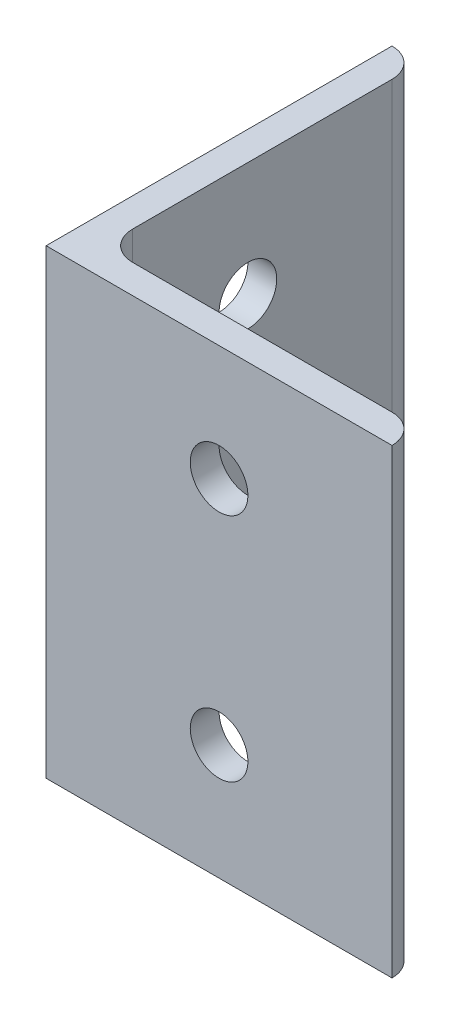
ISO-10303-21;
HEADER;
FILE_DESCRIPTION(('STEP AP214'),'2;1');
FILE_NAME('part.step','',(''),(''),'','','');
FILE_SCHEMA(('AUTOMOTIVE_DESIGN { 1 0 10303 214 1 1 1 1 }'));
ENDSEC;
DATA;
#1=APPLICATION_CONTEXT('core data for automotive mechanical design processes');
#2=APPLICATION_PROTOCOL_DEFINITION('international standard','automotive_design',2000,#1);
#3=PRODUCT_CONTEXT('',#1,'mechanical');
#4=PRODUCT('Part','Part','',(#3));
#5=PRODUCT_RELATED_PRODUCT_CATEGORY('part','',(#4));
#6=PRODUCT_DEFINITION_FORMATION('','',#4);
#7=PRODUCT_DEFINITION_CONTEXT('part definition',#1,'design');
#8=PRODUCT_DEFINITION('design','',#6,#7);
#9=PRODUCT_DEFINITION_SHAPE('','',#8);
#10=(LENGTH_UNIT() NAMED_UNIT(*) SI_UNIT(.MILLI.,.METRE.));
#11=(NAMED_UNIT(*) PLANE_ANGLE_UNIT() SI_UNIT($,.RADIAN.));
#12=(NAMED_UNIT(*) SI_UNIT($,.STERADIAN.) SOLID_ANGLE_UNIT());
#13=UNCERTAINTY_MEASURE_WITH_UNIT(LENGTH_MEASURE(1.E-05),#10,'distance_accuracy_value','');
#14=(GEOMETRIC_REPRESENTATION_CONTEXT(3) GLOBAL_UNCERTAINTY_ASSIGNED_CONTEXT((#13)) GLOBAL_UNIT_ASSIGNED_CONTEXT((#10,
#11,#12)) REPRESENTATION_CONTEXT('',''));
#15=CARTESIAN_POINT('',(0.,0.,0.));
#16=DIRECTION('',(0.,0.,1.));
#17=DIRECTION('',(1.,0.,0.));
#18=AXIS2_PLACEMENT_3D('',#15,#16,#17);
#19=CARTESIAN_POINT('',(0.,25.4,0.));
#20=DIRECTION('',(0.,0.,-1.));
#21=DIRECTION('',(-1.,0.,0.));
#22=AXIS2_PLACEMENT_3D('',#19,#20,#21);
#23=PLANE('',#22);
#24=CARTESIAN_POINT('',(19.0499999999997,-12.7,0.));
#25=DIRECTION('',(0.,0.,-1.));
#26=DIRECTION('',(-1.,0.,0.));
#27=AXIS2_PLACEMENT_3D('',#24,#25,#26);
#28=CIRCLE('',#27,3.175);
#29=CARTESIAN_POINT('',(15.8749999999997,-12.7,0.));
#30=VERTEX_POINT('',#29);
#31=EDGE_CURVE('E160',#30,#30,#28,.T.);
#32=ORIENTED_EDGE('',*,*,#31,.T.);
#33=EDGE_LOOP('',(#32));
#34=FACE_BOUND('',#33,.T.);
#35=CARTESIAN_POINT('',(19.05,12.7,0.));
#36=DIRECTION('',(0.,0.,-1.));
#37=DIRECTION('',(-1.,0.,0.));
#38=AXIS2_PLACEMENT_3D('',#35,#36,#37);
#39=CIRCLE('',#38,3.175);
#40=CARTESIAN_POINT('',(15.875,12.7,0.));
#41=VERTEX_POINT('',#40);
#42=EDGE_CURVE('E151',#41,#41,#39,.T.);
#43=ORIENTED_EDGE('',*,*,#42,.T.);
#44=EDGE_LOOP('',(#43));
#45=FACE_BOUND('',#44,.T.);
#46=DIRECTION('',(1.,0.,0.));
#47=VECTOR('',#46,1.);
#48=CARTESIAN_POINT('',(0.,-25.4,0.));
#49=LINE('',#48,#47);
#50=CARTESIAN_POINT('',(0.,-25.4,0.));
#51=VERTEX_POINT('',#50);
#52=CARTESIAN_POINT('',(38.1,-25.4,0.));
#53=VERTEX_POINT('',#52);
#54=EDGE_CURVE('E116',#51,#53,#49,.T.);
#55=ORIENTED_EDGE('',*,*,#54,.T.);
#56=DIRECTION('',(0.,-1.,0.));
#57=VECTOR('',#56,1.);
#58=CARTESIAN_POINT('',(38.1,25.4,0.));
#59=LINE('',#58,#57);
#60=CARTESIAN_POINT('',(38.1,25.4,0.));
#61=VERTEX_POINT('',#60);
#62=EDGE_CURVE('E114',#61,#53,#59,.T.);
#63=ORIENTED_EDGE('',*,*,#62,.F.);
#64=DIRECTION('',(1.,0.,0.));
#65=VECTOR('',#64,1.);
#66=CARTESIAN_POINT('',(0.,25.4,0.));
#67=LINE('',#66,#65);
#68=CARTESIAN_POINT('',(0.,25.4,0.));
#69=VERTEX_POINT('',#68);
#70=EDGE_CURVE('E101',#69,#61,#67,.T.);
#71=ORIENTED_EDGE('',*,*,#70,.F.);
#72=DIRECTION('',(0.,-1.,0.));
#73=VECTOR('',#72,1.);
#74=CARTESIAN_POINT('',(0.,25.4,0.));
#75=LINE('',#74,#73);
#76=EDGE_CURVE('E141',#69,#51,#75,.T.);
#77=ORIENTED_EDGE('',*,*,#76,.T.);
#78=EDGE_LOOP('',(#55,#63,#71,#77));
#79=FACE_BOUND('',#78,.T.);
#80=ADVANCED_FACE('F44',(#34,#45,#79),#23,.F.);
#81=CARTESIAN_POINT('',(0.,25.4,-3.175));
#82=DIRECTION('',(0.,0.,-1.));
#83=DIRECTION('',(-1.,0.,0.));
#84=AXIS2_PLACEMENT_3D('',#81,#82,#83);
#85=PLANE('',#84);
#86=CARTESIAN_POINT('',(19.0499999999997,-12.7,-3.175));
#87=DIRECTION('',(0.,0.,-1.));
#88=DIRECTION('',(-1.,0.,0.));
#89=AXIS2_PLACEMENT_3D('',#86,#87,#88);
#90=CIRCLE('',#89,3.175);
#91=CARTESIAN_POINT('',(15.8749999999997,-12.7,-3.175));
#92=VERTEX_POINT('',#91);
#93=EDGE_CURVE('E163',#92,#92,#90,.T.);
#94=ORIENTED_EDGE('',*,*,#93,.F.);
#95=EDGE_LOOP('',(#94));
#96=FACE_BOUND('',#95,.T.);
#97=CARTESIAN_POINT('',(19.05,12.7,-3.175));
#98=DIRECTION('',(0.,0.,-1.));
#99=DIRECTION('',(-1.,0.,0.));
#100=AXIS2_PLACEMENT_3D('',#97,#98,#99);
#101=CIRCLE('',#100,3.175);
#102=CARTESIAN_POINT('',(15.875,12.7,-3.175));
#103=VERTEX_POINT('',#102);
#104=EDGE_CURVE('E157',#103,#103,#101,.T.);
#105=ORIENTED_EDGE('',*,*,#104,.F.);
#106=EDGE_LOOP('',(#105));
#107=FACE_BOUND('',#106,.T.);
#108=DIRECTION('',(1.,0.,0.));
#109=VECTOR('',#108,1.);
#110=CARTESIAN_POINT('',(0.,-25.4,-3.175));
#111=LINE('',#110,#109);
#112=CARTESIAN_POINT('',(6.35,-25.4,-3.175));
#113=VERTEX_POINT('',#112);
#114=CARTESIAN_POINT('',(34.925,-25.4,-3.175));
#115=VERTEX_POINT('',#114);
#116=EDGE_CURVE('E147',#113,#115,#111,.T.);
#117=ORIENTED_EDGE('',*,*,#116,.F.);
#118=DIRECTION('',(0.,-1.,0.));
#119=VECTOR('',#118,1.);
#120=CARTESIAN_POINT('',(6.35,25.4,-3.175));
#121=LINE('',#120,#119);
#122=CARTESIAN_POINT('',(6.35,25.4,-3.175));
#123=VERTEX_POINT('',#122);
#124=EDGE_CURVE('E66',#113,#123,#121,.F.);
#125=ORIENTED_EDGE('',*,*,#124,.T.);
#126=DIRECTION('',(1.,0.,0.));
#127=VECTOR('',#126,1.);
#128=CARTESIAN_POINT('',(0.,25.4,-3.175));
#129=LINE('',#128,#127);
#130=CARTESIAN_POINT('',(34.925,25.4,-3.175));
#131=VERTEX_POINT('',#130);
#132=EDGE_CURVE('E109',#123,#131,#129,.T.);
#133=ORIENTED_EDGE('',*,*,#132,.T.);
#134=DIRECTION('',(0.,-1.,0.));
#135=VECTOR('',#134,1.);
#136=CARTESIAN_POINT('',(34.925,25.4,-3.175));
#137=LINE('',#136,#135);
#138=EDGE_CURVE('E124',#131,#115,#137,.T.);
#139=ORIENTED_EDGE('',*,*,#138,.T.);
#140=EDGE_LOOP('',(#117,#125,#133,#139));
#141=FACE_BOUND('',#140,.T.);
#142=ADVANCED_FACE('F194',(#96,#107,#141),#85,.T.);
#143=CARTESIAN_POINT('',(3.175,25.4,-38.1));
#144=DIRECTION('',(1.,0.,0.));
#145=DIRECTION('',(0.,0.,-1.));
#146=AXIS2_PLACEMENT_3D('',#143,#144,#145);
#147=PLANE('',#146);
#148=CARTESIAN_POINT('',(3.175,-12.7,-19.0499999999997));
#149=DIRECTION('',(1.,0.,0.));
#150=DIRECTION('',(0.,0.,-1.));
#151=AXIS2_PLACEMENT_3D('',#148,#149,#150);
#152=CIRCLE('',#151,3.175);
#153=CARTESIAN_POINT('',(3.175,-12.7,-15.8749999999997));
#154=VERTEX_POINT('',#153);
#155=EDGE_CURVE('E174',#154,#154,#152,.T.);
#156=ORIENTED_EDGE('',*,*,#155,.F.);
#157=EDGE_LOOP('',(#156));
#158=FACE_BOUND('',#157,.T.);
#159=CARTESIAN_POINT('',(3.175,12.7,-19.05));
#160=DIRECTION('',(1.,0.,0.));
#161=DIRECTION('',(0.,0.,-1.));
#162=AXIS2_PLACEMENT_3D('',#159,#160,#161);
#163=CIRCLE('',#162,3.175);
#164=CARTESIAN_POINT('',(3.175,12.7,-15.875));
#165=VERTEX_POINT('',#164);
#166=EDGE_CURVE('E166',#165,#165,#163,.T.);
#167=ORIENTED_EDGE('',*,*,#166,.F.);
#168=EDGE_LOOP('',(#167));
#169=FACE_BOUND('',#168,.T.);
#170=DIRECTION('',(0.,0.,1.));
#171=VECTOR('',#170,1.);
#172=CARTESIAN_POINT('',(3.175,25.4,-38.1));
#173=LINE('',#172,#171);
#174=CARTESIAN_POINT('',(3.175,25.4,-34.925));
#175=VERTEX_POINT('',#174);
#176=CARTESIAN_POINT('',(3.175,25.4,-6.35));
#177=VERTEX_POINT('',#176);
#178=EDGE_CURVE('E153',#175,#177,#173,.T.);
#179=ORIENTED_EDGE('',*,*,#178,.T.);
#180=DIRECTION('',(0.,-1.,0.));
#181=VECTOR('',#180,1.);
#182=CARTESIAN_POINT('',(3.175,-25.4,-6.35));
#183=LINE('',#182,#181);
#184=CARTESIAN_POINT('',(3.175,-25.4,-6.35));
#185=VERTEX_POINT('',#184);
#186=EDGE_CURVE('E135',#177,#185,#183,.T.);
#187=ORIENTED_EDGE('',*,*,#186,.T.);
#188=DIRECTION('',(0.,0.,1.));
#189=VECTOR('',#188,1.);
#190=CARTESIAN_POINT('',(3.175,-25.4,-38.1));
#191=LINE('',#190,#189);
#192=CARTESIAN_POINT('',(3.175,-25.4,-34.925));
#193=VERTEX_POINT('',#192);
#194=EDGE_CURVE('E144',#193,#185,#191,.T.);
#195=ORIENTED_EDGE('',*,*,#194,.F.);
#196=DIRECTION('',(0.,-1.,0.));
#197=VECTOR('',#196,1.);
#198=CARTESIAN_POINT('',(3.175,25.4,-34.925));
#199=LINE('',#198,#197);
#200=EDGE_CURVE('E118',#193,#175,#199,.F.);
#201=ORIENTED_EDGE('',*,*,#200,.T.);
#202=EDGE_LOOP('',(#179,#187,#195,#201));
#203=FACE_BOUND('',#202,.T.);
#204=ADVANCED_FACE('F186',(#158,#169,#203),#147,.T.);
#205=CARTESIAN_POINT('',(0.,25.4,-38.1));
#206=DIRECTION('',(1.,0.,0.));
#207=DIRECTION('',(0.,0.,-1.));
#208=AXIS2_PLACEMENT_3D('',#205,#206,#207);
#209=PLANE('',#208);
#210=CARTESIAN_POINT('',(0.,-12.7,-19.0499999999997));
#211=DIRECTION('',(-1.,0.,0.));
#212=DIRECTION('',(0.,0.,1.));
#213=AXIS2_PLACEMENT_3D('',#210,#211,#212);
#214=CIRCLE('',#213,3.175);
#215=CARTESIAN_POINT('',(0.,-12.7,-15.8749999999997));
#216=VERTEX_POINT('',#215);
#217=EDGE_CURVE('E177',#216,#216,#214,.T.);
#218=ORIENTED_EDGE('',*,*,#217,.F.);
#219=EDGE_LOOP('',(#218));
#220=FACE_BOUND('',#219,.T.);
#221=CARTESIAN_POINT('',(0.,12.7,-19.05));
#222=DIRECTION('',(-1.,0.,0.));
#223=DIRECTION('',(0.,0.,1.));
#224=AXIS2_PLACEMENT_3D('',#221,#222,#223);
#225=CIRCLE('',#224,3.175);
#226=CARTESIAN_POINT('',(0.,12.7,-15.875));
#227=VERTEX_POINT('',#226);
#228=EDGE_CURVE('E171',#227,#227,#225,.T.);
#229=ORIENTED_EDGE('',*,*,#228,.F.);
#230=EDGE_LOOP('',(#229));
#231=FACE_BOUND('',#230,.T.);
#232=DIRECTION('',(0.,0.,1.));
#233=VECTOR('',#232,1.);
#234=CARTESIAN_POINT('',(0.,-25.4,-38.1));
#235=LINE('',#234,#233);
#236=CARTESIAN_POINT('',(0.,-25.4,-38.1));
#237=VERTEX_POINT('',#236);
#238=EDGE_CURVE('E110',#237,#51,#235,.T.);
#239=ORIENTED_EDGE('',*,*,#238,.T.);
#240=ORIENTED_EDGE('',*,*,#76,.F.);
#241=DIRECTION('',(0.,0.,1.));
#242=VECTOR('',#241,1.);
#243=CARTESIAN_POINT('',(0.,25.4,-38.1));
#244=LINE('',#243,#242);
#245=CARTESIAN_POINT('',(0.,25.4,-38.1));
#246=VERTEX_POINT('',#245);
#247=EDGE_CURVE('E105',#246,#69,#244,.T.);
#248=ORIENTED_EDGE('',*,*,#247,.F.);
#249=DIRECTION('',(0.,-1.,0.));
#250=VECTOR('',#249,1.);
#251=CARTESIAN_POINT('',(0.,25.4,-38.1));
#252=LINE('',#251,#250);
#253=EDGE_CURVE('E119',#246,#237,#252,.T.);
#254=ORIENTED_EDGE('',*,*,#253,.T.);
#255=EDGE_LOOP('',(#239,#240,#248,#254));
#256=FACE_BOUND('',#255,.T.);
#257=ADVANCED_FACE('F183',(#220,#231,#256),#209,.F.);
#258=CARTESIAN_POINT('',(0.,25.4,0.));
#259=DIRECTION('',(0.,-1.,0.));
#260=DIRECTION('',(-1.,0.,0.));
#261=AXIS2_PLACEMENT_3D('',#258,#259,#260);
#262=PLANE('',#261);
#263=ORIENTED_EDGE('',*,*,#70,.T.);
#264=CARTESIAN_POINT('',(34.925,25.4,0.));
#265=DIRECTION('',(0.,-1.,0.));
#266=DIRECTION('',(0.,0.,-1.));
#267=AXIS2_PLACEMENT_3D('',#264,#265,#266);
#268=CIRCLE('',#267,3.175);
#269=EDGE_CURVE('E59',#61,#131,#268,.F.);
#270=ORIENTED_EDGE('',*,*,#269,.T.);
#271=ORIENTED_EDGE('',*,*,#132,.F.);
#272=CARTESIAN_POINT('',(6.35,25.4,-6.35));
#273=DIRECTION('',(0.,-1.,0.));
#274=DIRECTION('',(0.,0.,-1.));
#275=AXIS2_PLACEMENT_3D('',#272,#273,#274);
#276=CIRCLE('',#275,3.175);
#277=EDGE_CURVE('E13',#123,#177,#276,.T.);
#278=ORIENTED_EDGE('',*,*,#277,.T.);
#279=ORIENTED_EDGE('',*,*,#178,.F.);
#280=CARTESIAN_POINT('',(0.,25.4,-34.925));
#281=DIRECTION('',(0.,-1.,0.));
#282=DIRECTION('',(0.,0.,-1.));
#283=AXIS2_PLACEMENT_3D('',#280,#281,#282);
#284=CIRCLE('',#283,3.175);
#285=EDGE_CURVE('E125',#175,#246,#284,.F.);
#286=ORIENTED_EDGE('',*,*,#285,.T.);
#287=ORIENTED_EDGE('',*,*,#247,.T.);
#288=EDGE_LOOP('',(#263,#270,#271,#278,#279,#286,#287));
#289=FACE_BOUND('',#288,.T.);
#290=ADVANCED_FACE('F103',(#289),#262,.F.);
#291=CARTESIAN_POINT('',(0.,-25.4,0.));
#292=DIRECTION('',(0.,-1.,0.));
#293=DIRECTION('',(-1.,0.,0.));
#294=AXIS2_PLACEMENT_3D('',#291,#292,#293);
#295=PLANE('',#294);
#296=ORIENTED_EDGE('',*,*,#116,.T.);
#297=CARTESIAN_POINT('',(34.925,-25.4,0.));
#298=DIRECTION('',(0.,-1.,0.));
#299=DIRECTION('',(0.,0.,-1.));
#300=AXIS2_PLACEMENT_3D('',#297,#298,#299);
#301=CIRCLE('',#300,3.175);
#302=EDGE_CURVE('E127',#115,#53,#301,.T.);
#303=ORIENTED_EDGE('',*,*,#302,.T.);
#304=ORIENTED_EDGE('',*,*,#54,.F.);
#305=ORIENTED_EDGE('',*,*,#238,.F.);
#306=CARTESIAN_POINT('',(0.,-25.4,-34.925));
#307=DIRECTION('',(0.,-1.,0.));
#308=DIRECTION('',(0.,0.,-1.));
#309=AXIS2_PLACEMENT_3D('',#306,#307,#308);
#310=CIRCLE('',#309,3.175);
#311=EDGE_CURVE('E131',#237,#193,#310,.T.);
#312=ORIENTED_EDGE('',*,*,#311,.T.);
#313=ORIENTED_EDGE('',*,*,#194,.T.);
#314=CARTESIAN_POINT('',(6.35,-25.4,-6.35));
#315=DIRECTION('',(0.,-1.,0.));
#316=DIRECTION('',(0.,0.,-1.));
#317=AXIS2_PLACEMENT_3D('',#314,#315,#316);
#318=CIRCLE('',#317,3.175);
#319=EDGE_CURVE('E52',#185,#113,#318,.F.);
#320=ORIENTED_EDGE('',*,*,#319,.T.);
#321=EDGE_LOOP('',(#296,#303,#304,#305,#312,#313,#320));
#322=FACE_BOUND('',#321,.T.);
#323=ADVANCED_FACE('F193',(#322),#295,.T.);
#324=CARTESIAN_POINT('',(6.35,25.4,-6.35));
#325=DIRECTION('',(0.,1.,0.));
#326=DIRECTION('',(0.,0.,1.));
#327=AXIS2_PLACEMENT_3D('',#324,#325,#326);
#328=CYLINDRICAL_SURFACE('',#327,3.175);
#329=ORIENTED_EDGE('',*,*,#277,.F.);
#330=ORIENTED_EDGE('',*,*,#124,.F.);
#331=ORIENTED_EDGE('',*,*,#319,.F.);
#332=ORIENTED_EDGE('',*,*,#186,.F.);
#333=EDGE_LOOP('',(#329,#330,#331,#332));
#334=FACE_BOUND('',#333,.T.);
#335=ADVANCED_FACE('F199',(#334),#328,.F.);
#336=CARTESIAN_POINT('',(34.925,25.4,0.));
#337=DIRECTION('',(0.,-1.,0.));
#338=DIRECTION('',(0.,0.,-1.));
#339=AXIS2_PLACEMENT_3D('',#336,#337,#338);
#340=CYLINDRICAL_SURFACE('',#339,3.175);
#341=ORIENTED_EDGE('',*,*,#269,.F.);
#342=ORIENTED_EDGE('',*,*,#62,.T.);
#343=ORIENTED_EDGE('',*,*,#302,.F.);
#344=ORIENTED_EDGE('',*,*,#138,.F.);
#345=EDGE_LOOP('',(#341,#342,#343,#344));
#346=FACE_BOUND('',#345,.T.);
#347=ADVANCED_FACE('F122',(#346),#340,.T.);
#348=CARTESIAN_POINT('',(0.,25.4,-34.925));
#349=DIRECTION('',(0.,-1.,0.));
#350=DIRECTION('',(0.,0.,-1.));
#351=AXIS2_PLACEMENT_3D('',#348,#349,#350);
#352=CYLINDRICAL_SURFACE('',#351,3.175);
#353=ORIENTED_EDGE('',*,*,#285,.F.);
#354=ORIENTED_EDGE('',*,*,#200,.F.);
#355=ORIENTED_EDGE('',*,*,#311,.F.);
#356=ORIENTED_EDGE('',*,*,#253,.F.);
#357=EDGE_LOOP('',(#353,#354,#355,#356));
#358=FACE_BOUND('',#357,.T.);
#359=ADVANCED_FACE('F46',(#358),#352,.T.);
#360=CARTESIAN_POINT('',(19.05,12.7,0.));
#361=DIRECTION('',(0.,0.,-1.));
#362=DIRECTION('',(-1.,0.,0.));
#363=AXIS2_PLACEMENT_3D('',#360,#361,#362);
#364=CYLINDRICAL_SURFACE('',#363,3.175);
#365=ORIENTED_EDGE('',*,*,#42,.F.);
#366=EDGE_LOOP('',(#365));
#367=FACE_BOUND('',#366,.T.);
#368=ORIENTED_EDGE('',*,*,#104,.T.);
#369=EDGE_LOOP('',(#368));
#370=FACE_BOUND('',#369,.T.);
#371=ADVANCED_FACE('F206',(#367,#370),#364,.F.);
#372=CARTESIAN_POINT('',(19.0499999999997,-12.7,0.));
#373=DIRECTION('',(0.,0.,-1.));
#374=DIRECTION('',(-1.,0.,0.));
#375=AXIS2_PLACEMENT_3D('',#372,#373,#374);
#376=CYLINDRICAL_SURFACE('',#375,3.175);
#377=ORIENTED_EDGE('',*,*,#31,.F.);
#378=EDGE_LOOP('',(#377));
#379=FACE_BOUND('',#378,.T.);
#380=ORIENTED_EDGE('',*,*,#93,.T.);
#381=EDGE_LOOP('',(#380));
#382=FACE_BOUND('',#381,.T.);
#383=ADVANCED_FACE('F211',(#379,#382),#376,.F.);
#384=CARTESIAN_POINT('',(38.1,12.7,-19.05));
#385=DIRECTION('',(-1.,0.,0.));
#386=DIRECTION('',(0.,0.,1.));
#387=AXIS2_PLACEMENT_3D('',#384,#385,#386);
#388=CYLINDRICAL_SURFACE('',#387,3.175);
#389=CARTESIAN_POINT('',(3.175,12.7,-15.875));
#390=CARTESIAN_POINT('',(3.14192708333333,12.7,-15.875));
#391=CARTESIAN_POINT('',(3.10885416666667,12.7,-15.875));
#392=CARTESIAN_POINT('',(3.04270833333333,12.7,-15.875));
#393=CARTESIAN_POINT('',(3.00963541666666,12.7,-15.875));
#394=CARTESIAN_POINT('',(2.94348958333333,12.7,-15.875));
#395=CARTESIAN_POINT('',(2.91041666666666,12.7,-15.875));
#396=CARTESIAN_POINT('',(2.84427083333333,12.7,-15.875));
#397=CARTESIAN_POINT('',(2.81119791666667,12.7,-15.875));
#398=CARTESIAN_POINT('',(2.74505208333333,12.7,-15.875));
#399=CARTESIAN_POINT('',(2.71197916666666,12.7,-15.875));
#400=CARTESIAN_POINT('',(2.64583333333333,12.7,-15.875));
#401=CARTESIAN_POINT('',(2.61276041666666,12.7,-15.875));
#402=CARTESIAN_POINT('',(2.54661458333333,12.7,-15.875));
#403=CARTESIAN_POINT('',(2.51354166666667,12.7,-15.875));
#404=CARTESIAN_POINT('',(2.44739583333333,12.7,-15.875));
#405=CARTESIAN_POINT('',(2.41432291666667,12.7,-15.875));
#406=CARTESIAN_POINT('',(2.34817708333333,12.7,-15.875));
#407=CARTESIAN_POINT('',(2.31510416666667,12.7,-15.875));
#408=CARTESIAN_POINT('',(2.24895833333333,12.7,-15.875));
#409=CARTESIAN_POINT('',(2.21588541666666,12.7,-15.875));
#410=CARTESIAN_POINT('',(2.14973958333333,12.7,-15.875));
#411=CARTESIAN_POINT('',(2.11666666666667,12.7,-15.875));
#412=CARTESIAN_POINT('',(2.05052083333333,12.7,-15.875));
#413=CARTESIAN_POINT('',(2.01744791666667,12.7,-15.875));
#414=CARTESIAN_POINT('',(1.95130208333333,12.7,-15.875));
#415=CARTESIAN_POINT('',(1.91822916666666,12.7,-15.875));
#416=CARTESIAN_POINT('',(1.85208333333333,12.7,-15.875));
#417=CARTESIAN_POINT('',(1.81901041666667,12.7,-15.875));
#418=CARTESIAN_POINT('',(1.75286458333333,12.7,-15.875));
#419=CARTESIAN_POINT('',(1.71979166666666,12.7,-15.875));
#420=CARTESIAN_POINT('',(1.65364583333333,12.7,-15.875));
#421=CARTESIAN_POINT('',(1.62057291666666,12.7,-15.875));
#422=CARTESIAN_POINT('',(1.55442708333333,12.7,-15.875));
#423=CARTESIAN_POINT('',(1.52135416666667,12.7,-15.875));
#424=CARTESIAN_POINT('',(1.45520833333333,12.7,-15.875));
#425=CARTESIAN_POINT('',(1.42213541666666,12.7,-15.875));
#426=CARTESIAN_POINT('',(1.35598958333333,12.7,-15.875));
#427=CARTESIAN_POINT('',(1.32291666666666,12.7,-15.875));
#428=CARTESIAN_POINT('',(1.25677083333333,12.7,-15.875));
#429=CARTESIAN_POINT('',(1.22369791666667,12.7,-15.875));
#430=CARTESIAN_POINT('',(1.15755208333333,12.7,-15.875));
#431=CARTESIAN_POINT('',(1.12447916666666,12.7,-15.875));
#432=CARTESIAN_POINT('',(1.05833333333333,12.7,-15.875));
#433=CARTESIAN_POINT('',(1.02526041666666,12.7,-15.875));
#434=CARTESIAN_POINT('',(0.959114583333332,12.7,-15.875));
#435=CARTESIAN_POINT('',(0.926041666666666,12.7,-15.875));
#436=CARTESIAN_POINT('',(0.859895833333332,12.7,-15.875));
#437=CARTESIAN_POINT('',(0.826822916666664,12.7,-15.875));
#438=CARTESIAN_POINT('',(0.76067708333333,12.7,-15.875));
#439=CARTESIAN_POINT('',(0.727604166666664,12.7,-15.875));
#440=CARTESIAN_POINT('',(0.661458333333332,12.7,-15.875));
#441=CARTESIAN_POINT('',(0.628385416666666,12.7,-15.875));
#442=CARTESIAN_POINT('',(0.562239583333334,12.7,-15.875));
#443=CARTESIAN_POINT('',(0.529166666666669,12.7,-15.875));
#444=CARTESIAN_POINT('',(0.463020833333334,12.7,-15.875));
#445=CARTESIAN_POINT('',(0.429947916666666,12.7,-15.875));
#446=CARTESIAN_POINT('',(0.363802083333332,12.7,-15.875));
#447=CARTESIAN_POINT('',(0.330729166666666,12.7,-15.875));
#448=CARTESIAN_POINT('',(0.264583333333334,12.7,-15.875));
#449=CARTESIAN_POINT('',(0.231510416666668,12.7,-15.875));
#450=CARTESIAN_POINT('',(0.165364583333334,12.7,-15.875));
#451=CARTESIAN_POINT('',(0.132291666666666,12.7,-15.875));
#452=CARTESIAN_POINT('',(0.0661458333333318,12.7,-15.875));
#453=CARTESIAN_POINT('',(0.0330729166666659,12.7,-15.875));
#454=CARTESIAN_POINT('',(0.,12.7,-15.875));
#455=B_SPLINE_CURVE_WITH_KNOTS('',3,(#389,#390,#391,#392,#393,#394,#395,#396,#397,#398,#399,
#400,#401,#402,#403,#404,#405,#406,#407,#408,#409,#410,#411,#412,#413,#414,#415,#416,#417,#418,
#419,#420,#421,#422,#423,#424,#425,#426,#427,#428,#429,#430,#431,#432,#433,#434,#435,#436,#437,
#438,#439,#440,#441,#442,#443,#444,#445,#446,#447,#448,#449,#450,#451,#452,#453,#454),
.UNSPECIFIED.,.F.,.F.,(4,2,2,2,2,2,2,2,2,2,2,2,2,2,2,2,2,2,2,2,2,2,2,2,2,2,2,2,2,2,2,2,4),(0.,
0.0992187499999977,0.198437500000002,0.29765625,0.396874999999998,0.496093750000003,0.5953125,
0.694531249999998,0.793749999999996,0.892968750000001,0.992187499999998,1.09140625,1.190625,
1.28984375,1.3890625,1.48828125,1.5875,1.68671875,1.7859375,1.88515625,1.984375,2.08359375,
2.1828125,2.28203125,2.38125,2.48046875,2.5796875,2.67890624999999,2.778125,2.87734375,
2.97656249999999,3.07578125,3.175),.UNSPECIFIED.);
#456=EDGE_CURVE('BSEAM242',#165,#227,#455,.T.);
#457=ORIENTED_EDGE('',*,*,#166,.T.);
#458=ORIENTED_EDGE('',*,*,#228,.T.);
#459=ORIENTED_EDGE('',*,*,#456,.T.);
#460=ORIENTED_EDGE('',*,*,#456,.F.);
#461=EDGE_LOOP('',(#457,#459,#458,#460));
#462=FACE_BOUND('',#461,.T.);
#463=ADVANCED_FACE('F242',(#462),#388,.F.);
#464=CARTESIAN_POINT('',(38.1,-12.7,-19.0499999999997));
#465=DIRECTION('',(-1.,0.,0.));
#466=DIRECTION('',(0.,0.,1.));
#467=AXIS2_PLACEMENT_3D('',#464,#465,#466);
#468=CYLINDRICAL_SURFACE('',#467,3.175);
#469=CARTESIAN_POINT('',(3.175,-12.7,-15.8749999999997));
#470=CARTESIAN_POINT('',(3.14192708333333,-12.7,-15.8749999999997));
#471=CARTESIAN_POINT('',(3.10885416666667,-12.7,-15.8749999999997));
#472=CARTESIAN_POINT('',(3.04270833333333,-12.7,-15.8749999999997));
#473=CARTESIAN_POINT('',(3.00963541666666,-12.7,-15.8749999999997));
#474=CARTESIAN_POINT('',(2.94348958333333,-12.7,-15.8749999999997));
#475=CARTESIAN_POINT('',(2.91041666666666,-12.7,-15.8749999999997));
#476=CARTESIAN_POINT('',(2.84427083333333,-12.7,-15.8749999999997));
#477=CARTESIAN_POINT('',(2.81119791666667,-12.7,-15.8749999999997));
#478=CARTESIAN_POINT('',(2.74505208333333,-12.7,-15.8749999999997));
#479=CARTESIAN_POINT('',(2.71197916666666,-12.7,-15.8749999999997));
#480=CARTESIAN_POINT('',(2.64583333333333,-12.7,-15.8749999999997));
#481=CARTESIAN_POINT('',(2.61276041666666,-12.7,-15.8749999999997));
#482=CARTESIAN_POINT('',(2.54661458333333,-12.7,-15.8749999999997));
#483=CARTESIAN_POINT('',(2.51354166666667,-12.7,-15.8749999999997));
#484=CARTESIAN_POINT('',(2.44739583333333,-12.7,-15.8749999999997));
#485=CARTESIAN_POINT('',(2.41432291666667,-12.7,-15.8749999999997));
#486=CARTESIAN_POINT('',(2.34817708333333,-12.7,-15.8749999999997));
#487=CARTESIAN_POINT('',(2.31510416666667,-12.7,-15.8749999999997));
#488=CARTESIAN_POINT('',(2.24895833333333,-12.7,-15.8749999999997));
#489=CARTESIAN_POINT('',(2.21588541666666,-12.7,-15.8749999999997));
#490=CARTESIAN_POINT('',(2.14973958333333,-12.7,-15.8749999999997));
#491=CARTESIAN_POINT('',(2.11666666666667,-12.7,-15.8749999999997));
#492=CARTESIAN_POINT('',(2.05052083333333,-12.7,-15.8749999999997));
#493=CARTESIAN_POINT('',(2.01744791666667,-12.7,-15.8749999999997));
#494=CARTESIAN_POINT('',(1.95130208333333,-12.7,-15.8749999999997));
#495=CARTESIAN_POINT('',(1.91822916666666,-12.7,-15.8749999999997));
#496=CARTESIAN_POINT('',(1.85208333333333,-12.7,-15.8749999999997));
#497=CARTESIAN_POINT('',(1.81901041666667,-12.7,-15.8749999999997));
#498=CARTESIAN_POINT('',(1.75286458333333,-12.7,-15.8749999999997));
#499=CARTESIAN_POINT('',(1.71979166666666,-12.7,-15.8749999999997));
#500=CARTESIAN_POINT('',(1.65364583333333,-12.7,-15.8749999999997));
#501=CARTESIAN_POINT('',(1.62057291666666,-12.7,-15.8749999999997));
#502=CARTESIAN_POINT('',(1.55442708333333,-12.7,-15.8749999999997));
#503=CARTESIAN_POINT('',(1.52135416666667,-12.7,-15.8749999999997));
#504=CARTESIAN_POINT('',(1.45520833333333,-12.7,-15.8749999999997));
#505=CARTESIAN_POINT('',(1.42213541666666,-12.7,-15.8749999999997));
#506=CARTESIAN_POINT('',(1.35598958333333,-12.7,-15.8749999999997));
#507=CARTESIAN_POINT('',(1.32291666666666,-12.7,-15.8749999999997));
#508=CARTESIAN_POINT('',(1.25677083333333,-12.7,-15.8749999999997));
#509=CARTESIAN_POINT('',(1.22369791666667,-12.7,-15.8749999999997));
#510=CARTESIAN_POINT('',(1.15755208333333,-12.7,-15.8749999999997));
#511=CARTESIAN_POINT('',(1.12447916666666,-12.7,-15.8749999999997));
#512=CARTESIAN_POINT('',(1.05833333333333,-12.7,-15.8749999999997));
#513=CARTESIAN_POINT('',(1.02526041666666,-12.7,-15.8749999999997));
#514=CARTESIAN_POINT('',(0.959114583333332,-12.7,-15.8749999999997));
#515=CARTESIAN_POINT('',(0.926041666666666,-12.7,-15.8749999999997));
#516=CARTESIAN_POINT('',(0.859895833333332,-12.7,-15.8749999999997));
#517=CARTESIAN_POINT('',(0.826822916666664,-12.7,-15.8749999999997));
#518=CARTESIAN_POINT('',(0.76067708333333,-12.7,-15.8749999999997));
#519=CARTESIAN_POINT('',(0.727604166666664,-12.7,-15.8749999999997));
#520=CARTESIAN_POINT('',(0.661458333333332,-12.7,-15.8749999999997));
#521=CARTESIAN_POINT('',(0.628385416666666,-12.7,-15.8749999999997));
#522=CARTESIAN_POINT('',(0.562239583333334,-12.7,-15.8749999999997));
#523=CARTESIAN_POINT('',(0.529166666666669,-12.7,-15.8749999999997));
#524=CARTESIAN_POINT('',(0.463020833333334,-12.7,-15.8749999999997));
#525=CARTESIAN_POINT('',(0.429947916666666,-12.7,-15.8749999999997));
#526=CARTESIAN_POINT('',(0.363802083333332,-12.7,-15.8749999999997));
#527=CARTESIAN_POINT('',(0.330729166666666,-12.7,-15.8749999999997));
#528=CARTESIAN_POINT('',(0.264583333333334,-12.7,-15.8749999999997));
#529=CARTESIAN_POINT('',(0.231510416666668,-12.7,-15.8749999999997));
#530=CARTESIAN_POINT('',(0.165364583333334,-12.7,-15.8749999999997));
#531=CARTESIAN_POINT('',(0.132291666666666,-12.7,-15.8749999999997));
#532=CARTESIAN_POINT('',(0.0661458333333318,-12.7,-15.8749999999997));
#533=CARTESIAN_POINT('',(0.0330729166666659,-12.7,-15.8749999999997));
#534=CARTESIAN_POINT('',(0.,-12.7,-15.8749999999997));
#535=B_SPLINE_CURVE_WITH_KNOTS('',3,(#469,#470,#471,#472,#473,#474,#475,#476,#477,#478,#479,
#480,#481,#482,#483,#484,#485,#486,#487,#488,#489,#490,#491,#492,#493,#494,#495,#496,#497,#498,
#499,#500,#501,#502,#503,#504,#505,#506,#507,#508,#509,#510,#511,#512,#513,#514,#515,#516,#517,
#518,#519,#520,#521,#522,#523,#524,#525,#526,#527,#528,#529,#530,#531,#532,#533,#534),
.UNSPECIFIED.,.F.,.F.,(4,2,2,2,2,2,2,2,2,2,2,2,2,2,2,2,2,2,2,2,2,2,2,2,2,2,2,2,2,2,2,2,4),(0.,
0.0992187499999977,0.198437500000002,0.29765625,0.396874999999998,0.496093750000003,0.5953125,
0.694531249999998,0.793749999999996,0.892968750000001,0.992187499999998,1.09140625,1.190625,
1.28984375,1.3890625,1.48828125,1.5875,1.68671875,1.7859375,1.88515625,1.984375,2.08359375,
2.1828125,2.28203125,2.38125,2.48046875,2.5796875,2.67890624999999,2.778125,2.87734375,
2.97656249999999,3.07578125,3.175),.UNSPECIFIED.);
#536=EDGE_CURVE('BSEAM181',#154,#216,#535,.T.);
#537=ORIENTED_EDGE('',*,*,#155,.T.);
#538=ORIENTED_EDGE('',*,*,#217,.T.);
#539=ORIENTED_EDGE('',*,*,#536,.T.);
#540=ORIENTED_EDGE('',*,*,#536,.F.);
#541=EDGE_LOOP('',(#537,#539,#538,#540));
#542=FACE_BOUND('',#541,.T.);
#543=ADVANCED_FACE('F181',(#542),#468,.F.);
#544=CLOSED_SHELL('',(#80,#142,#204,#257,#290,#323,#335,#347,#359,#371,#383,#463,#543));
#545=MANIFOLD_SOLID_BREP('B2',#544);
#546=ADVANCED_BREP_SHAPE_REPRESENTATION('',(#18,#545),#14);
#547=SHAPE_DEFINITION_REPRESENTATION(#9,#546);
ENDSEC;
END-ISO-10303-21;
